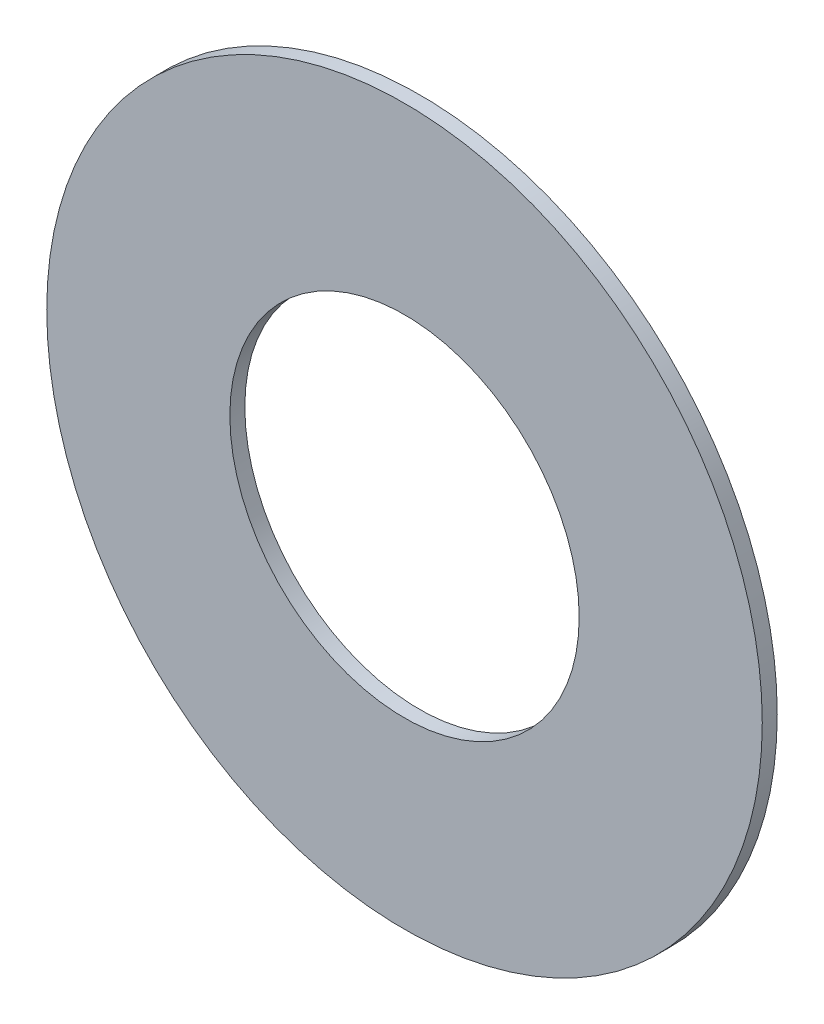
ISO-10303-21;
HEADER;
FILE_DESCRIPTION(('STEP AP214'),'2;1');
FILE_NAME('part.step','',(''),(''),'','','');
FILE_SCHEMA(('AUTOMOTIVE_DESIGN { 1 0 10303 214 1 1 1 1 }'));
ENDSEC;
DATA;
#1=APPLICATION_CONTEXT('core data for automotive mechanical design processes');
#2=APPLICATION_PROTOCOL_DEFINITION('international standard','automotive_design',2000,#1);
#3=PRODUCT_CONTEXT('',#1,'mechanical');
#4=PRODUCT('Part','Part','',(#3));
#5=PRODUCT_RELATED_PRODUCT_CATEGORY('part','',(#4));
#6=PRODUCT_DEFINITION_FORMATION('','',#4);
#7=PRODUCT_DEFINITION_CONTEXT('part definition',#1,'design');
#8=PRODUCT_DEFINITION('design','',#6,#7);
#9=PRODUCT_DEFINITION_SHAPE('','',#8);
#10=(LENGTH_UNIT() NAMED_UNIT(*) SI_UNIT(.MILLI.,.METRE.));
#11=(NAMED_UNIT(*) PLANE_ANGLE_UNIT() SI_UNIT($,.RADIAN.));
#12=(NAMED_UNIT(*) SI_UNIT($,.STERADIAN.) SOLID_ANGLE_UNIT());
#13=UNCERTAINTY_MEASURE_WITH_UNIT(LENGTH_MEASURE(1.E-05),#10,'distance_accuracy_value','');
#14=(GEOMETRIC_REPRESENTATION_CONTEXT(3) GLOBAL_UNCERTAINTY_ASSIGNED_CONTEXT((#13)) GLOBAL_UNIT_ASSIGNED_CONTEXT((#10,
#11,#12)) REPRESENTATION_CONTEXT('',''));
#15=CARTESIAN_POINT('',(0.,0.,0.));
#16=DIRECTION('',(0.,0.,1.));
#17=DIRECTION('',(1.,0.,0.));
#18=AXIS2_PLACEMENT_3D('',#15,#16,#17);
#19=CARTESIAN_POINT('',(0.,0.,0.));
#20=DIRECTION('',(0.,0.,-1.));
#21=DIRECTION('',(1.,0.,0.));
#22=AXIS2_PLACEMENT_3D('',#19,#20,#21);
#23=CYLINDRICAL_SURFACE('',#22,0.8499983);
#24=CARTESIAN_POINT('',(0.,0.,0.03556));
#25=DIRECTION('',(0.,0.,1.));
#26=DIRECTION('',(1.,0.,0.));
#27=AXIS2_PLACEMENT_3D('',#24,#25,#26);
#28=CIRCLE('',#27,0.8499983);
#29=CARTESIAN_POINT('',(0.8499983,0.,0.03556));
#30=VERTEX_POINT('',#29);
#31=EDGE_CURVE('E11',#30,#30,#28,.T.);
#32=ORIENTED_EDGE('',*,*,#31,.F.);
#33=DIRECTION('',(0.,0.,1.));
#34=VECTOR('',#33,1.);
#35=CARTESIAN_POINT('',(0.8499983,0.,0.));
#36=LINE('',#35,#34);
#37=CARTESIAN_POINT('',(0.8499983,0.,0.));
#38=VERTEX_POINT('',#37);
#39=EDGE_CURVE('E24',#38,#30,#36,.T.);
#40=ORIENTED_EDGE('',*,*,#39,.F.);
#41=CARTESIAN_POINT('',(0.,0.,0.));
#42=DIRECTION('',(0.,0.,1.));
#43=DIRECTION('',(1.,0.,0.));
#44=AXIS2_PLACEMENT_3D('',#41,#42,#43);
#45=CIRCLE('',#44,0.8499983);
#46=EDGE_CURVE('E46',#38,#38,#45,.T.);
#47=ORIENTED_EDGE('',*,*,#46,.T.);
#48=ORIENTED_EDGE('',*,*,#39,.T.);
#49=EDGE_LOOP('',(#32,#40,#47,#48));
#50=FACE_BOUND('',#49,.T.);
#51=ADVANCED_FACE('F17',(#50),#23,.T.);
#52=CARTESIAN_POINT('',(0.,0.,0.));
#53=DIRECTION('',(0.,0.,-1.));
#54=DIRECTION('',(1.,0.,0.));
#55=AXIS2_PLACEMENT_3D('',#52,#53,#54);
#56=CYLINDRICAL_SURFACE('',#55,0.41500044);
#57=DIRECTION('',(0.,0.,1.));
#58=VECTOR('',#57,1.);
#59=CARTESIAN_POINT('',(0.41500044,0.,0.));
#60=LINE('',#59,#58);
#61=CARTESIAN_POINT('',(0.41500044,0.,0.));
#62=VERTEX_POINT('',#61);
#63=CARTESIAN_POINT('',(0.41500044,0.,0.03556));
#64=VERTEX_POINT('',#63);
#65=EDGE_CURVE('E40',#62,#64,#60,.T.);
#66=ORIENTED_EDGE('',*,*,#65,.T.);
#67=CARTESIAN_POINT('',(0.,0.,0.03556));
#68=DIRECTION('',(0.,0.,1.));
#69=DIRECTION('',(1.,0.,0.));
#70=AXIS2_PLACEMENT_3D('',#67,#68,#69);
#71=CIRCLE('',#70,0.41500044);
#72=EDGE_CURVE('E45',#64,#64,#71,.T.);
#73=ORIENTED_EDGE('',*,*,#72,.T.);
#74=ORIENTED_EDGE('',*,*,#65,.F.);
#75=CARTESIAN_POINT('',(0.,0.,0.));
#76=DIRECTION('',(0.,0.,1.));
#77=DIRECTION('',(1.,0.,0.));
#78=AXIS2_PLACEMENT_3D('',#75,#76,#77);
#79=CIRCLE('',#78,0.41500044);
#80=EDGE_CURVE('E43',#62,#62,#79,.T.);
#81=ORIENTED_EDGE('',*,*,#80,.F.);
#82=EDGE_LOOP('',(#66,#73,#74,#81));
#83=FACE_BOUND('',#82,.T.);
#84=ADVANCED_FACE('F42',(#83),#56,.F.);
#85=CARTESIAN_POINT('',(0.8499983,0.,0.));
#86=DIRECTION('',(0.,0.,-1.));
#87=DIRECTION('',(-1.,0.,0.));
#88=AXIS2_PLACEMENT_3D('',#85,#86,#87);
#89=PLANE('',#88);
#90=ORIENTED_EDGE('',*,*,#46,.F.);
#91=EDGE_LOOP('',(#90));
#92=FACE_BOUND('',#91,.T.);
#93=ORIENTED_EDGE('',*,*,#80,.T.);
#94=EDGE_LOOP('',(#93));
#95=FACE_BOUND('',#94,.T.);
#96=ADVANCED_FACE('F49',(#92,#95),#89,.T.);
#97=CARTESIAN_POINT('',(0.8499983,0.,0.03556));
#98=DIRECTION('',(0.,0.,-1.));
#99=DIRECTION('',(-1.,0.,0.));
#100=AXIS2_PLACEMENT_3D('',#97,#98,#99);
#101=PLANE('',#100);
#102=ORIENTED_EDGE('',*,*,#31,.T.);
#103=EDGE_LOOP('',(#102));
#104=FACE_BOUND('',#103,.T.);
#105=ORIENTED_EDGE('',*,*,#72,.F.);
#106=EDGE_LOOP('',(#105));
#107=FACE_BOUND('',#106,.T.);
#108=ADVANCED_FACE('F56',(#104,#107),#101,.F.);
#109=CLOSED_SHELL('',(#51,#84,#96,#108));
#110=MANIFOLD_SOLID_BREP('B1',#109);
#111=ADVANCED_BREP_SHAPE_REPRESENTATION('',(#18,#110),#14);
#112=SHAPE_DEFINITION_REPRESENTATION(#9,#111);
ENDSEC;
END-ISO-10303-21;
